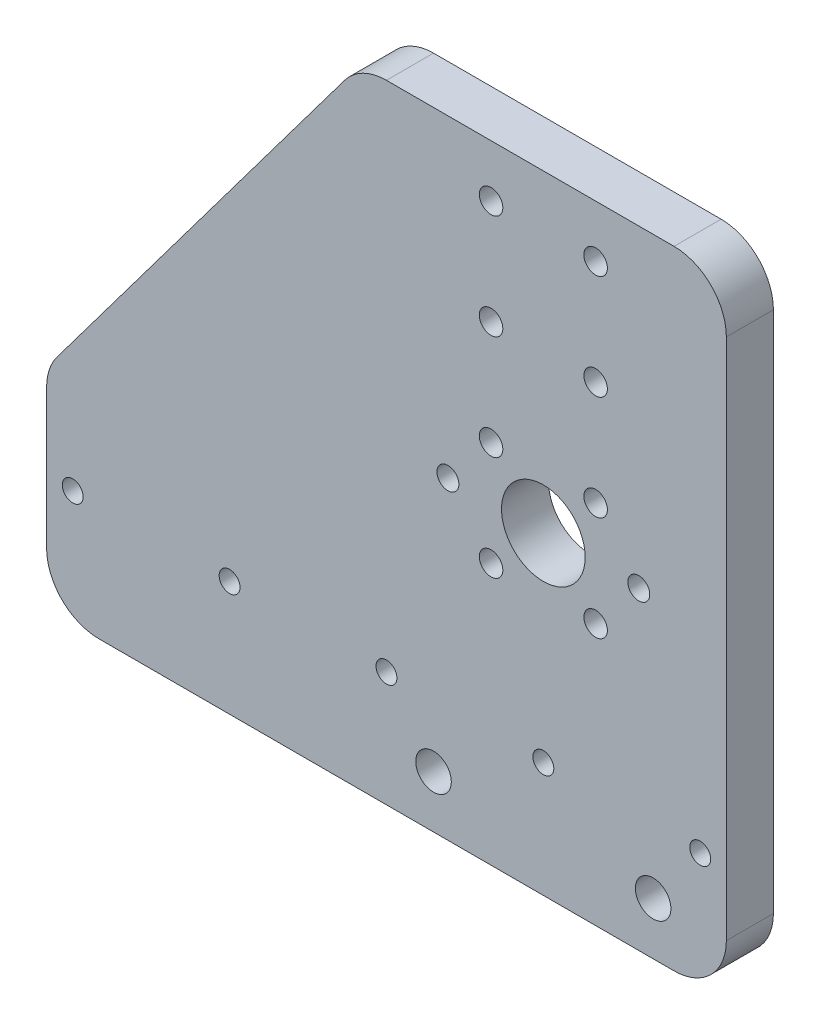
ISO-10303-21;
HEADER;
FILE_DESCRIPTION(('STEP AP214'),'2;1');
FILE_NAME('part.step','',(''),(''),'','','');
FILE_SCHEMA(('AUTOMOTIVE_DESIGN { 1 0 10303 214 1 1 1 1 }'));
ENDSEC;
DATA;
#1=APPLICATION_CONTEXT('core data for automotive mechanical design processes');
#2=APPLICATION_PROTOCOL_DEFINITION('international standard','automotive_design',2000,#1);
#3=PRODUCT_CONTEXT('',#1,'mechanical');
#4=PRODUCT('Part','Part','',(#3));
#5=PRODUCT_RELATED_PRODUCT_CATEGORY('part','',(#4));
#6=PRODUCT_DEFINITION_FORMATION('','',#4);
#7=PRODUCT_DEFINITION_CONTEXT('part definition',#1,'design');
#8=PRODUCT_DEFINITION('design','',#6,#7);
#9=PRODUCT_DEFINITION_SHAPE('','',#8);
#10=(LENGTH_UNIT() NAMED_UNIT(*) SI_UNIT(.MILLI.,.METRE.));
#11=(NAMED_UNIT(*) PLANE_ANGLE_UNIT() SI_UNIT($,.RADIAN.));
#12=(NAMED_UNIT(*) SI_UNIT($,.STERADIAN.) SOLID_ANGLE_UNIT());
#13=UNCERTAINTY_MEASURE_WITH_UNIT(LENGTH_MEASURE(1.E-05),#10,'distance_accuracy_value','');
#14=(GEOMETRIC_REPRESENTATION_CONTEXT(3) GLOBAL_UNCERTAINTY_ASSIGNED_CONTEXT((#13)) GLOBAL_UNIT_ASSIGNED_CONTEXT((#10,
#11,#12)) REPRESENTATION_CONTEXT('',''));
#15=CARTESIAN_POINT('',(0.,0.,0.));
#16=DIRECTION('',(0.,0.,1.));
#17=DIRECTION('',(1.,0.,0.));
#18=AXIS2_PLACEMENT_3D('',#15,#16,#17);
#19=CARTESIAN_POINT('',(0.,40.,9.));
#20=DIRECTION('',(1.,0.,0.));
#21=DIRECTION('',(0.,1.,0.));
#22=AXIS2_PLACEMENT_3D('',#19,#20,#21);
#23=PLANE('',#22);
#24=DIRECTION('',(0.,-1.,0.));
#25=VECTOR('',#24,1.);
#26=CARTESIAN_POINT('',(0.,40.,9.));
#27=LINE('',#26,#25);
#28=CARTESIAN_POINT('',(0.,36.6666666666666,9.));
#29=VERTEX_POINT('',#28);
#30=CARTESIAN_POINT('',(0.,10.,9.));
#31=VERTEX_POINT('',#30);
#32=EDGE_CURVE('E129',#29,#31,#27,.T.);
#33=ORIENTED_EDGE('',*,*,#32,.F.);
#34=DIRECTION('',(0.,0.,-1.));
#35=VECTOR('',#34,1.);
#36=CARTESIAN_POINT('',(0.,36.6666666666666,9.));
#37=LINE('',#36,#35);
#38=CARTESIAN_POINT('',(0.,36.6666666666666,0.));
#39=VERTEX_POINT('',#38);
#40=EDGE_CURVE('E114',#29,#39,#37,.T.);
#41=ORIENTED_EDGE('',*,*,#40,.T.);
#42=DIRECTION('',(0.,-1.,0.));
#43=VECTOR('',#42,1.);
#44=CARTESIAN_POINT('',(0.,40.,0.));
#45=LINE('',#44,#43);
#46=CARTESIAN_POINT('',(0.,10.,0.));
#47=VERTEX_POINT('',#46);
#48=EDGE_CURVE('E126',#39,#47,#45,.T.);
#49=ORIENTED_EDGE('',*,*,#48,.T.);
#50=DIRECTION('',(0.,0.,-1.));
#51=VECTOR('',#50,1.);
#52=CARTESIAN_POINT('',(0.,10.,9.));
#53=LINE('',#52,#51);
#54=EDGE_CURVE('E131',#47,#31,#53,.F.);
#55=ORIENTED_EDGE('',*,*,#54,.T.);
#56=EDGE_LOOP('',(#33,#41,#49,#55));
#57=FACE_BOUND('',#56,.T.);
#58=ADVANCED_FACE('F32',(#57),#23,.F.);
#59=CARTESIAN_POINT('',(0.,0.,9.));
#60=DIRECTION('',(0.,1.,0.));
#61=DIRECTION('',(0.,0.,1.));
#62=AXIS2_PLACEMENT_3D('',#59,#60,#61);
#63=PLANE('',#62);
#64=DIRECTION('',(1.,0.,0.));
#65=VECTOR('',#64,1.);
#66=CARTESIAN_POINT('',(0.,0.,0.));
#67=LINE('',#66,#65);
#68=CARTESIAN_POINT('',(10.,0.,0.));
#69=VERTEX_POINT('',#68);
#70=CARTESIAN_POINT('',(120.,0.,0.));
#71=VERTEX_POINT('',#70);
#72=EDGE_CURVE('E135',#69,#71,#67,.T.);
#73=ORIENTED_EDGE('',*,*,#72,.T.);
#74=DIRECTION('',(0.,0.,-1.));
#75=VECTOR('',#74,1.);
#76=CARTESIAN_POINT('',(120.,0.,9.));
#77=LINE('',#76,#75);
#78=CARTESIAN_POINT('',(120.,0.,9.));
#79=VERTEX_POINT('',#78);
#80=EDGE_CURVE('E11',#71,#79,#77,.F.);
#81=ORIENTED_EDGE('',*,*,#80,.T.);
#82=DIRECTION('',(1.,0.,0.));
#83=VECTOR('',#82,1.);
#84=CARTESIAN_POINT('',(0.,0.,9.));
#85=LINE('',#84,#83);
#86=CARTESIAN_POINT('',(10.,0.,9.));
#87=VERTEX_POINT('',#86);
#88=EDGE_CURVE('E188',#87,#79,#85,.T.);
#89=ORIENTED_EDGE('',*,*,#88,.F.);
#90=DIRECTION('',(0.,0.,-1.));
#91=VECTOR('',#90,1.);
#92=CARTESIAN_POINT('',(10.,0.,9.));
#93=LINE('',#92,#91);
#94=EDGE_CURVE('E40',#87,#69,#93,.T.);
#95=ORIENTED_EDGE('',*,*,#94,.T.);
#96=EDGE_LOOP('',(#73,#81,#89,#95));
#97=FACE_BOUND('',#96,.T.);
#98=ADVANCED_FACE('F185',(#97),#63,.F.);
#99=CARTESIAN_POINT('',(130.,0.,9.));
#100=DIRECTION('',(-1.,0.,0.));
#101=DIRECTION('',(0.,0.,1.));
#102=AXIS2_PLACEMENT_3D('',#99,#100,#101);
#103=PLANE('',#102);
#104=DIRECTION('',(0.,1.,0.));
#105=VECTOR('',#104,1.);
#106=CARTESIAN_POINT('',(130.,0.,0.));
#107=LINE('',#106,#105);
#108=CARTESIAN_POINT('',(130.,10.,0.));
#109=VERTEX_POINT('',#108);
#110=CARTESIAN_POINT('',(130.,110.,0.));
#111=VERTEX_POINT('',#110);
#112=EDGE_CURVE('E139',#109,#111,#107,.T.);
#113=ORIENTED_EDGE('',*,*,#112,.T.);
#114=DIRECTION('',(0.,0.,-1.));
#115=VECTOR('',#114,1.);
#116=CARTESIAN_POINT('',(130.,110.,9.));
#117=LINE('',#116,#115);
#118=CARTESIAN_POINT('',(130.,110.,9.));
#119=VERTEX_POINT('',#118);
#120=EDGE_CURVE('E180',#111,#119,#117,.F.);
#121=ORIENTED_EDGE('',*,*,#120,.T.);
#122=DIRECTION('',(0.,1.,0.));
#123=VECTOR('',#122,1.);
#124=CARTESIAN_POINT('',(130.,0.,9.));
#125=LINE('',#124,#123);
#126=CARTESIAN_POINT('',(130.,10.,9.));
#127=VERTEX_POINT('',#126);
#128=EDGE_CURVE('E200',#127,#119,#125,.T.);
#129=ORIENTED_EDGE('',*,*,#128,.F.);
#130=DIRECTION('',(0.,0.,-1.));
#131=VECTOR('',#130,1.);
#132=CARTESIAN_POINT('',(130.,10.,9.));
#133=LINE('',#132,#131);
#134=EDGE_CURVE('E177',#127,#109,#133,.T.);
#135=ORIENTED_EDGE('',*,*,#134,.T.);
#136=EDGE_LOOP('',(#113,#121,#129,#135));
#137=FACE_BOUND('',#136,.T.);
#138=ADVANCED_FACE('F198',(#137),#103,.F.);
#139=CARTESIAN_POINT('',(130.,120.,9.));
#140=DIRECTION('',(0.,-1.,0.));
#141=DIRECTION('',(1.,0.,0.));
#142=AXIS2_PLACEMENT_3D('',#139,#140,#141);
#143=PLANE('',#142);
#144=DIRECTION('',(-1.,0.,0.));
#145=VECTOR('',#144,1.);
#146=CARTESIAN_POINT('',(130.,120.,0.));
#147=LINE('',#146,#145);
#148=CARTESIAN_POINT('',(120.,120.,0.));
#149=VERTEX_POINT('',#148);
#150=CARTESIAN_POINT('',(65.,120.,0.));
#151=VERTEX_POINT('',#150);
#152=EDGE_CURVE('E150',#149,#151,#147,.T.);
#153=ORIENTED_EDGE('',*,*,#152,.T.);
#154=DIRECTION('',(0.,0.,-1.));
#155=VECTOR('',#154,1.);
#156=CARTESIAN_POINT('',(65.,120.,9.));
#157=LINE('',#156,#155);
#158=CARTESIAN_POINT('',(65.,120.,9.));
#159=VERTEX_POINT('',#158);
#160=EDGE_CURVE('E47',#151,#159,#157,.F.);
#161=ORIENTED_EDGE('',*,*,#160,.T.);
#162=DIRECTION('',(-1.,0.,0.));
#163=VECTOR('',#162,1.);
#164=CARTESIAN_POINT('',(130.,120.,9.));
#165=LINE('',#164,#163);
#166=CARTESIAN_POINT('',(120.,120.,9.));
#167=VERTEX_POINT('',#166);
#168=EDGE_CURVE('E201',#167,#159,#165,.T.);
#169=ORIENTED_EDGE('',*,*,#168,.F.);
#170=DIRECTION('',(0.,0.,-1.));
#171=VECTOR('',#170,1.);
#172=CARTESIAN_POINT('',(120.,120.,9.));
#173=LINE('',#172,#171);
#174=EDGE_CURVE('E173',#167,#149,#173,.T.);
#175=ORIENTED_EDGE('',*,*,#174,.T.);
#176=EDGE_LOOP('',(#153,#161,#169,#175));
#177=FACE_BOUND('',#176,.T.);
#178=ADVANCED_FACE('F376',(#177),#143,.F.);
#179=CARTESIAN_POINT('',(60.,120.,9.));
#180=DIRECTION('',(0.8,-0.6,0.));
#181=DIRECTION('',(0.6,0.8,0.));
#182=AXIS2_PLACEMENT_3D('',#179,#180,#181);
#183=PLANE('',#182);
#184=DIRECTION('',(-0.6,-0.8,0.));
#185=VECTOR('',#184,1.);
#186=CARTESIAN_POINT('',(60.,120.,0.));
#187=LINE('',#186,#185);
#188=CARTESIAN_POINT('',(57.,116.,0.));
#189=VERTEX_POINT('',#188);
#190=CARTESIAN_POINT('',(2.00000000000001,42.6666666666667,0.));
#191=VERTEX_POINT('',#190);
#192=EDGE_CURVE('E152',#189,#191,#187,.T.);
#193=ORIENTED_EDGE('',*,*,#192,.T.);
#194=DIRECTION('',(0.,0.,-1.));
#195=VECTOR('',#194,1.);
#196=CARTESIAN_POINT('',(2.,42.6666666666667,9.));
#197=LINE('',#196,#195);
#198=CARTESIAN_POINT('',(2.00000000000001,42.6666666666667,9.));
#199=VERTEX_POINT('',#198);
#200=EDGE_CURVE('E115',#191,#199,#197,.F.);
#201=ORIENTED_EDGE('',*,*,#200,.T.);
#202=DIRECTION('',(-0.6,-0.8,0.));
#203=VECTOR('',#202,1.);
#204=CARTESIAN_POINT('',(60.,120.,9.));
#205=LINE('',#204,#203);
#206=CARTESIAN_POINT('',(57.,116.,9.));
#207=VERTEX_POINT('',#206);
#208=EDGE_CURVE('E145',#207,#199,#205,.T.);
#209=ORIENTED_EDGE('',*,*,#208,.F.);
#210=DIRECTION('',(0.,0.,-1.));
#211=VECTOR('',#210,1.);
#212=CARTESIAN_POINT('',(57.,116.,9.));
#213=LINE('',#212,#211);
#214=EDGE_CURVE('E120',#207,#189,#213,.T.);
#215=ORIENTED_EDGE('',*,*,#214,.T.);
#216=EDGE_LOOP('',(#193,#201,#209,#215));
#217=FACE_BOUND('',#216,.T.);
#218=ADVANCED_FACE('F366',(#217),#183,.F.);
#219=CARTESIAN_POINT('',(0.,0.,9.));
#220=DIRECTION('',(0.,0.,1.));
#221=DIRECTION('',(1.,0.,0.));
#222=AXIS2_PLACEMENT_3D('',#219,#220,#221);
#223=PLANE('',#222);
#224=CARTESIAN_POINT('',(76.75,60.,9.));
#225=DIRECTION('',(0.,0.,-1.));
#226=DIRECTION('',(1.,0.,0.));
#227=AXIS2_PLACEMENT_3D('',#224,#225,#226);
#228=CIRCLE('',#227,2.1);
#229=CARTESIAN_POINT('',(78.85,60.,9.));
#230=VERTEX_POINT('',#229);
#231=EDGE_CURVE('E302',#230,#230,#228,.T.);
#232=ORIENTED_EDGE('',*,*,#231,.T.);
#233=EDGE_LOOP('',(#232));
#234=FACE_BOUND('',#233,.T.);
#235=CARTESIAN_POINT('',(113.25,60.,9.));
#236=DIRECTION('',(0.,0.,-1.));
#237=DIRECTION('',(-1.,0.,0.));
#238=AXIS2_PLACEMENT_3D('',#235,#236,#237);
#239=CIRCLE('',#238,2.1);
#240=CARTESIAN_POINT('',(111.15,60.,9.));
#241=VERTEX_POINT('',#240);
#242=EDGE_CURVE('E291',#241,#241,#239,.T.);
#243=ORIENTED_EDGE('',*,*,#242,.T.);
#244=EDGE_LOOP('',(#243));
#245=FACE_BOUND('',#244,.T.);
#246=CARTESIAN_POINT('',(74.,9.99999999999999,9.));
#247=DIRECTION('',(0.,0.,1.));
#248=DIRECTION('',(1.,0.,0.));
#249=AXIS2_PLACEMENT_3D('',#246,#247,#248);
#250=CIRCLE('',#249,3.4);
#251=CARTESIAN_POINT('',(77.4,9.99999999999999,9.));
#252=VERTEX_POINT('',#251);
#253=EDGE_CURVE('E294',#252,#252,#250,.T.);
#254=ORIENTED_EDGE('',*,*,#253,.F.);
#255=EDGE_LOOP('',(#254));
#256=FACE_BOUND('',#255,.T.);
#257=CARTESIAN_POINT('',(116.,9.99999999999999,9.));
#258=DIRECTION('',(0.,0.,1.));
#259=DIRECTION('',(-1.,0.,0.));
#260=AXIS2_PLACEMENT_3D('',#257,#258,#259);
#261=CIRCLE('',#260,3.4);
#262=CARTESIAN_POINT('',(112.6,9.99999999999999,9.));
#263=VERTEX_POINT('',#262);
#264=EDGE_CURVE('E287',#263,#263,#261,.T.);
#265=ORIENTED_EDGE('',*,*,#264,.F.);
#266=EDGE_LOOP('',(#265));
#267=FACE_BOUND('',#266,.T.);
#268=CARTESIAN_POINT('',(95.,60.,9.));
#269=DIRECTION('',(0.,0.,1.));
#270=DIRECTION('',(1.,0.,0.));
#271=AXIS2_PLACEMENT_3D('',#268,#269,#270);
#272=CIRCLE('',#271,8.);
#273=CARTESIAN_POINT('',(103.,60.,9.));
#274=VERTEX_POINT('',#273);
#275=EDGE_CURVE('E281',#274,#274,#272,.T.);
#276=ORIENTED_EDGE('',*,*,#275,.F.);
#277=EDGE_LOOP('',(#276));
#278=FACE_BOUND('',#277,.T.);
#279=CARTESIAN_POINT('',(105.,50.,9.));
#280=DIRECTION('',(0.,0.,1.));
#281=DIRECTION('',(1.,0.,0.));
#282=AXIS2_PLACEMENT_3D('',#279,#280,#281);
#283=CIRCLE('',#282,2.25000000000001);
#284=CARTESIAN_POINT('',(107.25,50.,9.));
#285=VERTEX_POINT('',#284);
#286=EDGE_CURVE('E251',#285,#285,#283,.T.);
#287=ORIENTED_EDGE('',*,*,#286,.F.);
#288=EDGE_LOOP('',(#287));
#289=FACE_BOUND('',#288,.T.);
#290=CARTESIAN_POINT('',(105.,110.,9.));
#291=DIRECTION('',(0.,0.,1.));
#292=DIRECTION('',(-1.,0.,0.));
#293=AXIS2_PLACEMENT_3D('',#290,#291,#292);
#294=CIRCLE('',#293,2.25000000000001);
#295=CARTESIAN_POINT('',(102.75,110.,9.));
#296=VERTEX_POINT('',#295);
#297=EDGE_CURVE('E258',#296,#296,#294,.T.);
#298=ORIENTED_EDGE('',*,*,#297,.F.);
#299=EDGE_LOOP('',(#298));
#300=FACE_BOUND('',#299,.T.);
#301=CARTESIAN_POINT('',(105.,90.,9.));
#302=DIRECTION('',(0.,0.,1.));
#303=DIRECTION('',(1.,0.,0.));
#304=AXIS2_PLACEMENT_3D('',#301,#302,#303);
#305=CIRCLE('',#304,2.25000000000001);
#306=CARTESIAN_POINT('',(107.25,90.,9.));
#307=VERTEX_POINT('',#306);
#308=EDGE_CURVE('E245',#307,#307,#305,.T.);
#309=ORIENTED_EDGE('',*,*,#308,.F.);
#310=EDGE_LOOP('',(#309));
#311=FACE_BOUND('',#310,.T.);
#312=CARTESIAN_POINT('',(105.,70.,9.));
#313=DIRECTION('',(0.,0.,1.));
#314=DIRECTION('',(-1.,0.,0.));
#315=AXIS2_PLACEMENT_3D('',#312,#313,#314);
#316=CIRCLE('',#315,2.25000000000001);
#317=CARTESIAN_POINT('',(102.75,70.,9.));
#318=VERTEX_POINT('',#317);
#319=EDGE_CURVE('E276',#318,#318,#316,.T.);
#320=ORIENTED_EDGE('',*,*,#319,.F.);
#321=EDGE_LOOP('',(#320));
#322=FACE_BOUND('',#321,.T.);
#323=CARTESIAN_POINT('',(85.,70.,9.));
#324=DIRECTION('',(0.,0.,1.));
#325=DIRECTION('',(1.,0.,0.));
#326=AXIS2_PLACEMENT_3D('',#323,#324,#325);
#327=CIRCLE('',#326,2.25);
#328=CARTESIAN_POINT('',(87.25,70.,9.));
#329=VERTEX_POINT('',#328);
#330=EDGE_CURVE('E270',#329,#329,#327,.T.);
#331=ORIENTED_EDGE('',*,*,#330,.F.);
#332=EDGE_LOOP('',(#331));
#333=FACE_BOUND('',#332,.T.);
#334=CARTESIAN_POINT('',(85.,50.,9.));
#335=DIRECTION('',(0.,0.,1.));
#336=DIRECTION('',(-1.,0.,0.));
#337=AXIS2_PLACEMENT_3D('',#334,#335,#336);
#338=CIRCLE('',#337,2.25);
#339=CARTESIAN_POINT('',(82.75,50.,9.));
#340=VERTEX_POINT('',#339);
#341=EDGE_CURVE('E263',#340,#340,#338,.T.);
#342=ORIENTED_EDGE('',*,*,#341,.F.);
#343=EDGE_LOOP('',(#342));
#344=FACE_BOUND('',#343,.T.);
#345=CARTESIAN_POINT('',(125.,22.,9.));
#346=DIRECTION('',(0.,0.,1.));
#347=DIRECTION('',(-1.,0.,0.));
#348=AXIS2_PLACEMENT_3D('',#345,#346,#347);
#349=CIRCLE('',#348,2.);
#350=CARTESIAN_POINT('',(123.,22.,9.));
#351=VERTEX_POINT('',#350);
#352=EDGE_CURVE('E215',#351,#351,#349,.T.);
#353=ORIENTED_EDGE('',*,*,#352,.F.);
#354=EDGE_LOOP('',(#353));
#355=FACE_BOUND('',#354,.T.);
#356=CARTESIAN_POINT('',(5.,22.,9.));
#357=DIRECTION('',(0.,0.,1.));
#358=DIRECTION('',(1.,0.,0.));
#359=AXIS2_PLACEMENT_3D('',#356,#357,#358);
#360=CIRCLE('',#359,2.);
#361=CARTESIAN_POINT('',(7.00000000000001,22.,9.));
#362=VERTEX_POINT('',#361);
#363=EDGE_CURVE('E222',#362,#362,#360,.T.);
#364=ORIENTED_EDGE('',*,*,#363,.F.);
#365=EDGE_LOOP('',(#364));
#366=FACE_BOUND('',#365,.T.);
#367=CARTESIAN_POINT('',(35.,22.,9.));
#368=DIRECTION('',(0.,0.,1.));
#369=DIRECTION('',(1.,0.,0.));
#370=AXIS2_PLACEMENT_3D('',#367,#368,#369);
#371=CIRCLE('',#370,2.);
#372=CARTESIAN_POINT('',(37.,22.,9.));
#373=VERTEX_POINT('',#372);
#374=EDGE_CURVE('E209',#373,#373,#371,.T.);
#375=ORIENTED_EDGE('',*,*,#374,.F.);
#376=EDGE_LOOP('',(#375));
#377=FACE_BOUND('',#376,.T.);
#378=CARTESIAN_POINT('',(95.,22.,9.));
#379=DIRECTION('',(0.,0.,1.));
#380=DIRECTION('',(-1.,0.,0.));
#381=AXIS2_PLACEMENT_3D('',#378,#379,#380);
#382=CIRCLE('',#381,2.);
#383=CARTESIAN_POINT('',(93.,22.,9.));
#384=VERTEX_POINT('',#383);
#385=EDGE_CURVE('E240',#384,#384,#382,.T.);
#386=ORIENTED_EDGE('',*,*,#385,.F.);
#387=EDGE_LOOP('',(#386));
#388=FACE_BOUND('',#387,.T.);
#389=CARTESIAN_POINT('',(85.,110.,9.));
#390=DIRECTION('',(0.,0.,1.));
#391=DIRECTION('',(1.,0.,0.));
#392=AXIS2_PLACEMENT_3D('',#389,#390,#391);
#393=CIRCLE('',#392,2.25);
#394=CARTESIAN_POINT('',(87.25,110.,9.));
#395=VERTEX_POINT('',#394);
#396=EDGE_CURVE('E234',#395,#395,#393,.T.);
#397=ORIENTED_EDGE('',*,*,#396,.F.);
#398=EDGE_LOOP('',(#397));
#399=FACE_BOUND('',#398,.T.);
#400=CARTESIAN_POINT('',(85.,90.,9.));
#401=DIRECTION('',(0.,0.,1.));
#402=DIRECTION('',(-1.,0.,0.));
#403=AXIS2_PLACEMENT_3D('',#400,#401,#402);
#404=CIRCLE('',#403,2.25);
#405=CARTESIAN_POINT('',(82.75,90.,9.));
#406=VERTEX_POINT('',#405);
#407=EDGE_CURVE('E227',#406,#406,#404,.T.);
#408=ORIENTED_EDGE('',*,*,#407,.F.);
#409=EDGE_LOOP('',(#408));
#410=FACE_BOUND('',#409,.T.);
#411=CARTESIAN_POINT('',(65.,22.,9.));
#412=DIRECTION('',(0.,0.,1.));
#413=DIRECTION('',(1.,0.,0.));
#414=AXIS2_PLACEMENT_3D('',#411,#412,#413);
#415=CIRCLE('',#414,2.);
#416=CARTESIAN_POINT('',(67.,22.,9.));
#417=VERTEX_POINT('',#416);
#418=EDGE_CURVE('E142',#417,#417,#415,.T.);
#419=ORIENTED_EDGE('',*,*,#418,.F.);
#420=EDGE_LOOP('',(#419));
#421=FACE_BOUND('',#420,.T.);
#422=ORIENTED_EDGE('',*,*,#208,.T.);
#423=CARTESIAN_POINT('',(10.,36.6666666666666,9.));
#424=DIRECTION('',(0.,0.,1.));
#425=DIRECTION('',(1.,0.,0.));
#426=AXIS2_PLACEMENT_3D('',#423,#424,#425);
#427=CIRCLE('',#426,10.);
#428=EDGE_CURVE('E171',#199,#29,#427,.T.);
#429=ORIENTED_EDGE('',*,*,#428,.T.);
#430=ORIENTED_EDGE('',*,*,#32,.T.);
#431=CARTESIAN_POINT('',(10.,10.,9.));
#432=DIRECTION('',(0.,0.,1.));
#433=DIRECTION('',(1.,0.,0.));
#434=AXIS2_PLACEMENT_3D('',#431,#432,#433);
#435=CIRCLE('',#434,10.);
#436=EDGE_CURVE('E164',#31,#87,#435,.T.);
#437=ORIENTED_EDGE('',*,*,#436,.T.);
#438=ORIENTED_EDGE('',*,*,#88,.T.);
#439=CARTESIAN_POINT('',(120.,10.,9.));
#440=DIRECTION('',(0.,0.,1.));
#441=DIRECTION('',(1.,0.,0.));
#442=AXIS2_PLACEMENT_3D('',#439,#440,#441);
#443=CIRCLE('',#442,10.);
#444=EDGE_CURVE('E166',#79,#127,#443,.T.);
#445=ORIENTED_EDGE('',*,*,#444,.T.);
#446=ORIENTED_EDGE('',*,*,#128,.T.);
#447=CARTESIAN_POINT('',(120.,110.,9.));
#448=DIRECTION('',(0.,0.,1.));
#449=DIRECTION('',(1.,0.,0.));
#450=AXIS2_PLACEMENT_3D('',#447,#448,#449);
#451=CIRCLE('',#450,10.);
#452=EDGE_CURVE('E54',#119,#167,#451,.T.);
#453=ORIENTED_EDGE('',*,*,#452,.T.);
#454=ORIENTED_EDGE('',*,*,#168,.T.);
#455=CARTESIAN_POINT('',(65.,110.,9.));
#456=DIRECTION('',(0.,0.,1.));
#457=DIRECTION('',(1.,0.,0.));
#458=AXIS2_PLACEMENT_3D('',#455,#456,#457);
#459=CIRCLE('',#458,10.);
#460=EDGE_CURVE('E169',#159,#207,#459,.T.);
#461=ORIENTED_EDGE('',*,*,#460,.T.);
#462=EDGE_LOOP('',(#422,#429,#430,#437,#438,#445,#446,#453,#454,#461));
#463=FACE_BOUND('',#462,.T.);
#464=ADVANCED_FACE('F311',(#234,#245,#256,#267,#278,#289,#300,#311,#322,#333,#344,#355,#366,
#377,#388,#399,#410,#421,#463),#223,.T.);
#465=CARTESIAN_POINT('',(0.,0.,0.));
#466=DIRECTION('',(0.,0.,1.));
#467=DIRECTION('',(1.,0.,0.));
#468=AXIS2_PLACEMENT_3D('',#465,#466,#467);
#469=PLANE('',#468);
#470=CARTESIAN_POINT('',(76.75,60.,0.));
#471=DIRECTION('',(0.,0.,-1.));
#472=DIRECTION('',(1.,0.,0.));
#473=AXIS2_PLACEMENT_3D('',#470,#471,#472);
#474=CIRCLE('',#473,2.1);
#475=CARTESIAN_POINT('',(78.85,60.,0.));
#476=VERTEX_POINT('',#475);
#477=EDGE_CURVE('E305',#476,#476,#474,.T.);
#478=ORIENTED_EDGE('',*,*,#477,.F.);
#479=EDGE_LOOP('',(#478));
#480=FACE_BOUND('',#479,.T.);
#481=CARTESIAN_POINT('',(113.25,60.,0.));
#482=DIRECTION('',(0.,0.,-1.));
#483=DIRECTION('',(-1.,0.,0.));
#484=AXIS2_PLACEMENT_3D('',#481,#482,#483);
#485=CIRCLE('',#484,2.1);
#486=CARTESIAN_POINT('',(111.15,60.,0.));
#487=VERTEX_POINT('',#486);
#488=EDGE_CURVE('E299',#487,#487,#485,.T.);
#489=ORIENTED_EDGE('',*,*,#488,.F.);
#490=EDGE_LOOP('',(#489));
#491=FACE_BOUND('',#490,.T.);
#492=CARTESIAN_POINT('',(74.,9.99999999999999,0.));
#493=DIRECTION('',(0.,0.,1.));
#494=DIRECTION('',(1.,0.,0.));
#495=AXIS2_PLACEMENT_3D('',#492,#493,#494);
#496=CIRCLE('',#495,3.4);
#497=CARTESIAN_POINT('',(77.4,9.99999999999999,0.));
#498=VERTEX_POINT('',#497);
#499=EDGE_CURVE('E284',#498,#498,#496,.T.);
#500=ORIENTED_EDGE('',*,*,#499,.T.);
#501=EDGE_LOOP('',(#500));
#502=FACE_BOUND('',#501,.T.);
#503=CARTESIAN_POINT('',(116.,9.99999999999999,0.));
#504=DIRECTION('',(0.,0.,1.));
#505=DIRECTION('',(-1.,0.,0.));
#506=AXIS2_PLACEMENT_3D('',#503,#504,#505);
#507=CIRCLE('',#506,3.4);
#508=CARTESIAN_POINT('',(112.6,9.99999999999999,0.));
#509=VERTEX_POINT('',#508);
#510=EDGE_CURVE('E290',#509,#509,#507,.T.);
#511=ORIENTED_EDGE('',*,*,#510,.T.);
#512=EDGE_LOOP('',(#511));
#513=FACE_BOUND('',#512,.T.);
#514=CARTESIAN_POINT('',(95.,60.,0.));
#515=DIRECTION('',(0.,0.,1.));
#516=DIRECTION('',(1.,0.,0.));
#517=AXIS2_PLACEMENT_3D('',#514,#515,#516);
#518=CIRCLE('',#517,8.);
#519=CARTESIAN_POINT('',(103.,60.,0.));
#520=VERTEX_POINT('',#519);
#521=EDGE_CURVE('E267',#520,#520,#518,.T.);
#522=ORIENTED_EDGE('',*,*,#521,.T.);
#523=EDGE_LOOP('',(#522));
#524=FACE_BOUND('',#523,.T.);
#525=CARTESIAN_POINT('',(105.,50.,0.));
#526=DIRECTION('',(0.,0.,1.));
#527=DIRECTION('',(1.,0.,0.));
#528=AXIS2_PLACEMENT_3D('',#525,#526,#527);
#529=CIRCLE('',#528,2.25000000000001);
#530=CARTESIAN_POINT('',(107.25,50.,0.));
#531=VERTEX_POINT('',#530);
#532=EDGE_CURVE('E254',#531,#531,#529,.T.);
#533=ORIENTED_EDGE('',*,*,#532,.T.);
#534=EDGE_LOOP('',(#533));
#535=FACE_BOUND('',#534,.T.);
#536=CARTESIAN_POINT('',(105.,110.,0.));
#537=DIRECTION('',(0.,0.,1.));
#538=DIRECTION('',(-1.,0.,0.));
#539=AXIS2_PLACEMENT_3D('',#536,#537,#538);
#540=CIRCLE('',#539,2.25000000000001);
#541=CARTESIAN_POINT('',(102.75,110.,0.));
#542=VERTEX_POINT('',#541);
#543=EDGE_CURVE('E248',#542,#542,#540,.T.);
#544=ORIENTED_EDGE('',*,*,#543,.T.);
#545=EDGE_LOOP('',(#544));
#546=FACE_BOUND('',#545,.T.);
#547=CARTESIAN_POINT('',(105.,90.,0.));
#548=DIRECTION('',(0.,0.,1.));
#549=DIRECTION('',(1.,0.,0.));
#550=AXIS2_PLACEMENT_3D('',#547,#548,#549);
#551=CIRCLE('',#550,2.25000000000001);
#552=CARTESIAN_POINT('',(107.25,90.,0.));
#553=VERTEX_POINT('',#552);
#554=EDGE_CURVE('E231',#553,#553,#551,.T.);
#555=ORIENTED_EDGE('',*,*,#554,.T.);
#556=EDGE_LOOP('',(#555));
#557=FACE_BOUND('',#556,.T.);
#558=CARTESIAN_POINT('',(105.,70.,0.));
#559=DIRECTION('',(0.,0.,1.));
#560=DIRECTION('',(-1.,0.,0.));
#561=AXIS2_PLACEMENT_3D('',#558,#559,#560);
#562=CIRCLE('',#561,2.25000000000001);
#563=CARTESIAN_POINT('',(102.75,70.,0.));
#564=VERTEX_POINT('',#563);
#565=EDGE_CURVE('E255',#564,#564,#562,.T.);
#566=ORIENTED_EDGE('',*,*,#565,.T.);
#567=EDGE_LOOP('',(#566));
#568=FACE_BOUND('',#567,.T.);
#569=CARTESIAN_POINT('',(85.,70.,0.));
#570=DIRECTION('',(0.,0.,1.));
#571=DIRECTION('',(1.,0.,0.));
#572=AXIS2_PLACEMENT_3D('',#569,#570,#571);
#573=CIRCLE('',#572,2.25);
#574=CARTESIAN_POINT('',(87.25,70.,0.));
#575=VERTEX_POINT('',#574);
#576=EDGE_CURVE('E273',#575,#575,#573,.T.);
#577=ORIENTED_EDGE('',*,*,#576,.T.);
#578=EDGE_LOOP('',(#577));
#579=FACE_BOUND('',#578,.T.);
#580=CARTESIAN_POINT('',(85.,50.,0.));
#581=DIRECTION('',(0.,0.,1.));
#582=DIRECTION('',(-1.,0.,0.));
#583=AXIS2_PLACEMENT_3D('',#580,#581,#582);
#584=CIRCLE('',#583,2.25);
#585=CARTESIAN_POINT('',(82.75,50.,0.));
#586=VERTEX_POINT('',#585);
#587=EDGE_CURVE('E266',#586,#586,#584,.T.);
#588=ORIENTED_EDGE('',*,*,#587,.T.);
#589=EDGE_LOOP('',(#588));
#590=FACE_BOUND('',#589,.T.);
#591=CARTESIAN_POINT('',(125.,22.,0.));
#592=DIRECTION('',(0.,0.,1.));
#593=DIRECTION('',(-1.,0.,0.));
#594=AXIS2_PLACEMENT_3D('',#591,#592,#593);
#595=CIRCLE('',#594,2.);
#596=CARTESIAN_POINT('',(123.,22.,0.));
#597=VERTEX_POINT('',#596);
#598=EDGE_CURVE('E218',#597,#597,#595,.T.);
#599=ORIENTED_EDGE('',*,*,#598,.T.);
#600=EDGE_LOOP('',(#599));
#601=FACE_BOUND('',#600,.T.);
#602=CARTESIAN_POINT('',(5.,22.,0.));
#603=DIRECTION('',(0.,0.,1.));
#604=DIRECTION('',(1.,0.,0.));
#605=AXIS2_PLACEMENT_3D('',#602,#603,#604);
#606=CIRCLE('',#605,2.);
#607=CARTESIAN_POINT('',(7.00000000000001,22.,0.));
#608=VERTEX_POINT('',#607);
#609=EDGE_CURVE('E212',#608,#608,#606,.T.);
#610=ORIENTED_EDGE('',*,*,#609,.T.);
#611=EDGE_LOOP('',(#610));
#612=FACE_BOUND('',#611,.T.);
#613=CARTESIAN_POINT('',(35.,22.,0.));
#614=DIRECTION('',(0.,0.,1.));
#615=DIRECTION('',(1.,0.,0.));
#616=AXIS2_PLACEMENT_3D('',#613,#614,#615);
#617=CIRCLE('',#616,2.);
#618=CARTESIAN_POINT('',(37.,22.,0.));
#619=VERTEX_POINT('',#618);
#620=EDGE_CURVE('E207',#619,#619,#617,.T.);
#621=ORIENTED_EDGE('',*,*,#620,.T.);
#622=EDGE_LOOP('',(#621));
#623=FACE_BOUND('',#622,.T.);
#624=CARTESIAN_POINT('',(95.,22.,0.));
#625=DIRECTION('',(0.,0.,1.));
#626=DIRECTION('',(-1.,0.,0.));
#627=AXIS2_PLACEMENT_3D('',#624,#625,#626);
#628=CIRCLE('',#627,2.);
#629=CARTESIAN_POINT('',(93.,22.,0.));
#630=VERTEX_POINT('',#629);
#631=EDGE_CURVE('E219',#630,#630,#628,.T.);
#632=ORIENTED_EDGE('',*,*,#631,.T.);
#633=EDGE_LOOP('',(#632));
#634=FACE_BOUND('',#633,.T.);
#635=CARTESIAN_POINT('',(85.,110.,0.));
#636=DIRECTION('',(0.,0.,1.));
#637=DIRECTION('',(1.,0.,0.));
#638=AXIS2_PLACEMENT_3D('',#635,#636,#637);
#639=CIRCLE('',#638,2.25);
#640=CARTESIAN_POINT('',(87.25,110.,0.));
#641=VERTEX_POINT('',#640);
#642=EDGE_CURVE('E237',#641,#641,#639,.T.);
#643=ORIENTED_EDGE('',*,*,#642,.T.);
#644=EDGE_LOOP('',(#643));
#645=FACE_BOUND('',#644,.T.);
#646=CARTESIAN_POINT('',(85.,90.,0.));
#647=DIRECTION('',(0.,0.,1.));
#648=DIRECTION('',(-1.,0.,0.));
#649=AXIS2_PLACEMENT_3D('',#646,#647,#648);
#650=CIRCLE('',#649,2.25);
#651=CARTESIAN_POINT('',(82.75,90.,0.));
#652=VERTEX_POINT('',#651);
#653=EDGE_CURVE('E230',#652,#652,#650,.T.);
#654=ORIENTED_EDGE('',*,*,#653,.T.);
#655=EDGE_LOOP('',(#654));
#656=FACE_BOUND('',#655,.T.);
#657=CARTESIAN_POINT('',(65.,22.,0.));
#658=DIRECTION('',(0.,0.,1.));
#659=DIRECTION('',(1.,0.,0.));
#660=AXIS2_PLACEMENT_3D('',#657,#658,#659);
#661=CIRCLE('',#660,2.);
#662=CARTESIAN_POINT('',(67.,22.,0.));
#663=VERTEX_POINT('',#662);
#664=EDGE_CURVE('E136',#663,#663,#661,.T.);
#665=ORIENTED_EDGE('',*,*,#664,.T.);
#666=EDGE_LOOP('',(#665));
#667=FACE_BOUND('',#666,.T.);
#668=ORIENTED_EDGE('',*,*,#48,.F.);
#669=CARTESIAN_POINT('',(10.,36.6666666666666,0.));
#670=DIRECTION('',(0.,0.,1.));
#671=DIRECTION('',(1.,0.,0.));
#672=AXIS2_PLACEMENT_3D('',#669,#670,#671);
#673=CIRCLE('',#672,10.);
#674=EDGE_CURVE('E110',#39,#191,#673,.F.);
#675=ORIENTED_EDGE('',*,*,#674,.T.);
#676=ORIENTED_EDGE('',*,*,#192,.F.);
#677=CARTESIAN_POINT('',(65.,110.,0.));
#678=DIRECTION('',(0.,0.,1.));
#679=DIRECTION('',(1.,0.,0.));
#680=AXIS2_PLACEMENT_3D('',#677,#678,#679);
#681=CIRCLE('',#680,10.);
#682=EDGE_CURVE('E121',#189,#151,#681,.F.);
#683=ORIENTED_EDGE('',*,*,#682,.T.);
#684=ORIENTED_EDGE('',*,*,#152,.F.);
#685=CARTESIAN_POINT('',(120.,110.,0.));
#686=DIRECTION('',(0.,0.,1.));
#687=DIRECTION('',(1.,0.,0.));
#688=AXIS2_PLACEMENT_3D('',#685,#686,#687);
#689=CIRCLE('',#688,10.);
#690=EDGE_CURVE('E158',#149,#111,#689,.F.);
#691=ORIENTED_EDGE('',*,*,#690,.T.);
#692=ORIENTED_EDGE('',*,*,#112,.F.);
#693=CARTESIAN_POINT('',(120.,10.,0.));
#694=DIRECTION('',(0.,0.,1.));
#695=DIRECTION('',(1.,0.,0.));
#696=AXIS2_PLACEMENT_3D('',#693,#694,#695);
#697=CIRCLE('',#696,10.);
#698=EDGE_CURVE('E156',#109,#71,#697,.F.);
#699=ORIENTED_EDGE('',*,*,#698,.T.);
#700=ORIENTED_EDGE('',*,*,#72,.F.);
#701=CARTESIAN_POINT('',(10.,10.,0.));
#702=DIRECTION('',(0.,0.,1.));
#703=DIRECTION('',(1.,0.,0.));
#704=AXIS2_PLACEMENT_3D('',#701,#702,#703);
#705=CIRCLE('',#704,10.);
#706=EDGE_CURVE('E130',#69,#47,#705,.F.);
#707=ORIENTED_EDGE('',*,*,#706,.T.);
#708=EDGE_LOOP('',(#668,#675,#676,#683,#684,#691,#692,#699,#700,#707));
#709=FACE_BOUND('',#708,.T.);
#710=ADVANCED_FACE('F133',(#480,#491,#502,#513,#524,#535,#546,#557,#568,#579,#590,#601,#612,
#623,#634,#645,#656,#667,#709),#469,.F.);
#711=CARTESIAN_POINT('',(65.,22.,0.));
#712=DIRECTION('',(0.,0.,1.));
#713=DIRECTION('',(1.,0.,0.));
#714=AXIS2_PLACEMENT_3D('',#711,#712,#713);
#715=CYLINDRICAL_SURFACE('',#714,2.);
#716=ORIENTED_EDGE('',*,*,#664,.F.);
#717=EDGE_LOOP('',(#716));
#718=FACE_BOUND('',#717,.T.);
#719=ORIENTED_EDGE('',*,*,#418,.T.);
#720=EDGE_LOOP('',(#719));
#721=FACE_BOUND('',#720,.T.);
#722=ADVANCED_FACE('F323',(#718,#721),#715,.F.);
#723=CARTESIAN_POINT('',(85.,90.,0.));
#724=DIRECTION('',(0.,0.,1.));
#725=DIRECTION('',(1.,0.,0.));
#726=AXIS2_PLACEMENT_3D('',#723,#724,#725);
#727=CYLINDRICAL_SURFACE('',#726,2.25);
#728=ORIENTED_EDGE('',*,*,#653,.F.);
#729=EDGE_LOOP('',(#728));
#730=FACE_BOUND('',#729,.T.);
#731=ORIENTED_EDGE('',*,*,#407,.T.);
#732=EDGE_LOOP('',(#731));
#733=FACE_BOUND('',#732,.T.);
#734=ADVANCED_FACE('F361',(#730,#733),#727,.F.);
#735=CARTESIAN_POINT('',(85.,110.,0.));
#736=DIRECTION('',(0.,0.,1.));
#737=DIRECTION('',(1.,0.,0.));
#738=AXIS2_PLACEMENT_3D('',#735,#736,#737);
#739=CYLINDRICAL_SURFACE('',#738,2.25);
#740=ORIENTED_EDGE('',*,*,#642,.F.);
#741=EDGE_LOOP('',(#740));
#742=FACE_BOUND('',#741,.T.);
#743=ORIENTED_EDGE('',*,*,#396,.T.);
#744=EDGE_LOOP('',(#743));
#745=FACE_BOUND('',#744,.T.);
#746=ADVANCED_FACE('F444',(#742,#745),#739,.F.);
#747=CARTESIAN_POINT('',(95.,22.,0.));
#748=DIRECTION('',(0.,0.,1.));
#749=DIRECTION('',(1.,0.,0.));
#750=AXIS2_PLACEMENT_3D('',#747,#748,#749);
#751=CYLINDRICAL_SURFACE('',#750,2.);
#752=ORIENTED_EDGE('',*,*,#631,.F.);
#753=EDGE_LOOP('',(#752));
#754=FACE_BOUND('',#753,.T.);
#755=ORIENTED_EDGE('',*,*,#385,.T.);
#756=EDGE_LOOP('',(#755));
#757=FACE_BOUND('',#756,.T.);
#758=ADVANCED_FACE('F440',(#754,#757),#751,.F.);
#759=CARTESIAN_POINT('',(35.,22.,0.));
#760=DIRECTION('',(0.,0.,1.));
#761=DIRECTION('',(1.,0.,0.));
#762=AXIS2_PLACEMENT_3D('',#759,#760,#761);
#763=CYLINDRICAL_SURFACE('',#762,2.);
#764=ORIENTED_EDGE('',*,*,#620,.F.);
#765=EDGE_LOOP('',(#764));
#766=FACE_BOUND('',#765,.T.);
#767=ORIENTED_EDGE('',*,*,#374,.T.);
#768=EDGE_LOOP('',(#767));
#769=FACE_BOUND('',#768,.T.);
#770=ADVANCED_FACE('F443',(#766,#769),#763,.F.);
#771=CARTESIAN_POINT('',(5.,22.,0.));
#772=DIRECTION('',(0.,0.,1.));
#773=DIRECTION('',(1.,0.,0.));
#774=AXIS2_PLACEMENT_3D('',#771,#772,#773);
#775=CYLINDRICAL_SURFACE('',#774,2.);
#776=ORIENTED_EDGE('',*,*,#609,.F.);
#777=EDGE_LOOP('',(#776));
#778=FACE_BOUND('',#777,.T.);
#779=ORIENTED_EDGE('',*,*,#363,.T.);
#780=EDGE_LOOP('',(#779));
#781=FACE_BOUND('',#780,.T.);
#782=ADVANCED_FACE('F452',(#778,#781),#775,.F.);
#783=CARTESIAN_POINT('',(125.,22.,0.));
#784=DIRECTION('',(0.,0.,1.));
#785=DIRECTION('',(1.,0.,0.));
#786=AXIS2_PLACEMENT_3D('',#783,#784,#785);
#787=CYLINDRICAL_SURFACE('',#786,2.);
#788=ORIENTED_EDGE('',*,*,#598,.F.);
#789=EDGE_LOOP('',(#788));
#790=FACE_BOUND('',#789,.T.);
#791=ORIENTED_EDGE('',*,*,#352,.T.);
#792=EDGE_LOOP('',(#791));
#793=FACE_BOUND('',#792,.T.);
#794=ADVANCED_FACE('F428',(#790,#793),#787,.F.);
#795=CARTESIAN_POINT('',(85.,50.,0.));
#796=DIRECTION('',(0.,0.,1.));
#797=DIRECTION('',(1.,0.,0.));
#798=AXIS2_PLACEMENT_3D('',#795,#796,#797);
#799=CYLINDRICAL_SURFACE('',#798,2.25);
#800=ORIENTED_EDGE('',*,*,#587,.F.);
#801=EDGE_LOOP('',(#800));
#802=FACE_BOUND('',#801,.T.);
#803=ORIENTED_EDGE('',*,*,#341,.T.);
#804=EDGE_LOOP('',(#803));
#805=FACE_BOUND('',#804,.T.);
#806=ADVANCED_FACE('F424',(#802,#805),#799,.F.);
#807=CARTESIAN_POINT('',(85.,70.,0.));
#808=DIRECTION('',(0.,0.,1.));
#809=DIRECTION('',(1.,0.,0.));
#810=AXIS2_PLACEMENT_3D('',#807,#808,#809);
#811=CYLINDRICAL_SURFACE('',#810,2.25);
#812=ORIENTED_EDGE('',*,*,#576,.F.);
#813=EDGE_LOOP('',(#812));
#814=FACE_BOUND('',#813,.T.);
#815=ORIENTED_EDGE('',*,*,#330,.T.);
#816=EDGE_LOOP('',(#815));
#817=FACE_BOUND('',#816,.T.);
#818=ADVANCED_FACE('F420',(#814,#817),#811,.F.);
#819=CARTESIAN_POINT('',(105.,70.,0.));
#820=DIRECTION('',(0.,0.,1.));
#821=DIRECTION('',(1.,0.,0.));
#822=AXIS2_PLACEMENT_3D('',#819,#820,#821);
#823=CYLINDRICAL_SURFACE('',#822,2.25000000000001);
#824=ORIENTED_EDGE('',*,*,#565,.F.);
#825=EDGE_LOOP('',(#824));
#826=FACE_BOUND('',#825,.T.);
#827=ORIENTED_EDGE('',*,*,#319,.T.);
#828=EDGE_LOOP('',(#827));
#829=FACE_BOUND('',#828,.T.);
#830=ADVANCED_FACE('F416',(#826,#829),#823,.F.);
#831=CARTESIAN_POINT('',(105.,90.,0.));
#832=DIRECTION('',(0.,0.,1.));
#833=DIRECTION('',(1.,0.,0.));
#834=AXIS2_PLACEMENT_3D('',#831,#832,#833);
#835=CYLINDRICAL_SURFACE('',#834,2.25000000000001);
#836=ORIENTED_EDGE('',*,*,#554,.F.);
#837=EDGE_LOOP('',(#836));
#838=FACE_BOUND('',#837,.T.);
#839=ORIENTED_EDGE('',*,*,#308,.T.);
#840=EDGE_LOOP('',(#839));
#841=FACE_BOUND('',#840,.T.);
#842=ADVANCED_FACE('F419',(#838,#841),#835,.F.);
#843=CARTESIAN_POINT('',(105.,110.,0.));
#844=DIRECTION('',(0.,0.,1.));
#845=DIRECTION('',(1.,0.,0.));
#846=AXIS2_PLACEMENT_3D('',#843,#844,#845);
#847=CYLINDRICAL_SURFACE('',#846,2.25000000000001);
#848=ORIENTED_EDGE('',*,*,#543,.F.);
#849=EDGE_LOOP('',(#848));
#850=FACE_BOUND('',#849,.T.);
#851=ORIENTED_EDGE('',*,*,#297,.T.);
#852=EDGE_LOOP('',(#851));
#853=FACE_BOUND('',#852,.T.);
#854=ADVANCED_FACE('F430',(#850,#853),#847,.F.);
#855=CARTESIAN_POINT('',(105.,50.,0.));
#856=DIRECTION('',(0.,0.,1.));
#857=DIRECTION('',(1.,0.,0.));
#858=AXIS2_PLACEMENT_3D('',#855,#856,#857);
#859=CYLINDRICAL_SURFACE('',#858,2.25000000000001);
#860=ORIENTED_EDGE('',*,*,#532,.F.);
#861=EDGE_LOOP('',(#860));
#862=FACE_BOUND('',#861,.T.);
#863=ORIENTED_EDGE('',*,*,#286,.T.);
#864=EDGE_LOOP('',(#863));
#865=FACE_BOUND('',#864,.T.);
#866=ADVANCED_FACE('F414',(#862,#865),#859,.F.);
#867=CARTESIAN_POINT('',(95.,60.,0.));
#868=DIRECTION('',(0.,0.,1.));
#869=DIRECTION('',(1.,0.,0.));
#870=AXIS2_PLACEMENT_3D('',#867,#868,#869);
#871=CYLINDRICAL_SURFACE('',#870,8.);
#872=ORIENTED_EDGE('',*,*,#521,.F.);
#873=EDGE_LOOP('',(#872));
#874=FACE_BOUND('',#873,.T.);
#875=ORIENTED_EDGE('',*,*,#275,.T.);
#876=EDGE_LOOP('',(#875));
#877=FACE_BOUND('',#876,.T.);
#878=ADVANCED_FACE('F406',(#874,#877),#871,.F.);
#879=CARTESIAN_POINT('',(116.,9.99999999999999,0.));
#880=DIRECTION('',(0.,0.,1.));
#881=DIRECTION('',(1.,0.,0.));
#882=AXIS2_PLACEMENT_3D('',#879,#880,#881);
#883=CYLINDRICAL_SURFACE('',#882,3.4);
#884=ORIENTED_EDGE('',*,*,#510,.F.);
#885=EDGE_LOOP('',(#884));
#886=FACE_BOUND('',#885,.T.);
#887=ORIENTED_EDGE('',*,*,#264,.T.);
#888=EDGE_LOOP('',(#887));
#889=FACE_BOUND('',#888,.T.);
#890=ADVANCED_FACE('F400',(#886,#889),#883,.F.);
#891=CARTESIAN_POINT('',(74.,9.99999999999999,0.));
#892=DIRECTION('',(0.,0.,1.));
#893=DIRECTION('',(1.,0.,0.));
#894=AXIS2_PLACEMENT_3D('',#891,#892,#893);
#895=CYLINDRICAL_SURFACE('',#894,3.4);
#896=ORIENTED_EDGE('',*,*,#499,.F.);
#897=EDGE_LOOP('',(#896));
#898=FACE_BOUND('',#897,.T.);
#899=ORIENTED_EDGE('',*,*,#253,.T.);
#900=EDGE_LOOP('',(#899));
#901=FACE_BOUND('',#900,.T.);
#902=ADVANCED_FACE('F396',(#898,#901),#895,.F.);
#903=CARTESIAN_POINT('',(10.,36.6666666666666,9.));
#904=DIRECTION('',(0.,0.,-1.));
#905=DIRECTION('',(-1.,0.,0.));
#906=AXIS2_PLACEMENT_3D('',#903,#904,#905);
#907=CYLINDRICAL_SURFACE('',#906,10.);
#908=ORIENTED_EDGE('',*,*,#428,.F.);
#909=ORIENTED_EDGE('',*,*,#200,.F.);
#910=ORIENTED_EDGE('',*,*,#674,.F.);
#911=ORIENTED_EDGE('',*,*,#40,.F.);
#912=EDGE_LOOP('',(#908,#909,#910,#911));
#913=FACE_BOUND('',#912,.T.);
#914=ADVANCED_FACE('F113',(#913),#907,.T.);
#915=CARTESIAN_POINT('',(65.,110.,9.));
#916=DIRECTION('',(0.,0.,-1.));
#917=DIRECTION('',(-1.,0.,0.));
#918=AXIS2_PLACEMENT_3D('',#915,#916,#917);
#919=CYLINDRICAL_SURFACE('',#918,10.);
#920=ORIENTED_EDGE('',*,*,#460,.F.);
#921=ORIENTED_EDGE('',*,*,#160,.F.);
#922=ORIENTED_EDGE('',*,*,#682,.F.);
#923=ORIENTED_EDGE('',*,*,#214,.F.);
#924=EDGE_LOOP('',(#920,#921,#922,#923));
#925=FACE_BOUND('',#924,.T.);
#926=ADVANCED_FACE('F374',(#925),#919,.T.);
#927=CARTESIAN_POINT('',(120.,110.,9.));
#928=DIRECTION('',(0.,0.,-1.));
#929=DIRECTION('',(-1.,0.,0.));
#930=AXIS2_PLACEMENT_3D('',#927,#928,#929);
#931=CYLINDRICAL_SURFACE('',#930,10.);
#932=ORIENTED_EDGE('',*,*,#452,.F.);
#933=ORIENTED_EDGE('',*,*,#120,.F.);
#934=ORIENTED_EDGE('',*,*,#690,.F.);
#935=ORIENTED_EDGE('',*,*,#174,.F.);
#936=EDGE_LOOP('',(#932,#933,#934,#935));
#937=FACE_BOUND('',#936,.T.);
#938=ADVANCED_FACE('F379',(#937),#931,.T.);
#939=CARTESIAN_POINT('',(120.,10.,9.));
#940=DIRECTION('',(0.,0.,-1.));
#941=DIRECTION('',(-1.,0.,0.));
#942=AXIS2_PLACEMENT_3D('',#939,#940,#941);
#943=CYLINDRICAL_SURFACE('',#942,10.);
#944=ORIENTED_EDGE('',*,*,#444,.F.);
#945=ORIENTED_EDGE('',*,*,#80,.F.);
#946=ORIENTED_EDGE('',*,*,#698,.F.);
#947=ORIENTED_EDGE('',*,*,#134,.F.);
#948=EDGE_LOOP('',(#944,#945,#946,#947));
#949=FACE_BOUND('',#948,.T.);
#950=ADVANCED_FACE('F195',(#949),#943,.T.);
#951=CARTESIAN_POINT('',(10.,10.,9.));
#952=DIRECTION('',(0.,0.,-1.));
#953=DIRECTION('',(-1.,0.,0.));
#954=AXIS2_PLACEMENT_3D('',#951,#952,#953);
#955=CYLINDRICAL_SURFACE('',#954,10.);
#956=ORIENTED_EDGE('',*,*,#436,.F.);
#957=ORIENTED_EDGE('',*,*,#54,.F.);
#958=ORIENTED_EDGE('',*,*,#706,.F.);
#959=ORIENTED_EDGE('',*,*,#94,.F.);
#960=EDGE_LOOP('',(#956,#957,#958,#959));
#961=FACE_BOUND('',#960,.T.);
#962=ADVANCED_FACE('F34',(#961),#955,.T.);
#963=CARTESIAN_POINT('',(113.25,60.,9.));
#964=DIRECTION('',(0.,0.,-1.));
#965=DIRECTION('',(-1.,0.,0.));
#966=AXIS2_PLACEMENT_3D('',#963,#964,#965);
#967=CYLINDRICAL_SURFACE('',#966,2.1);
#968=ORIENTED_EDGE('',*,*,#242,.F.);
#969=EDGE_LOOP('',(#968));
#970=FACE_BOUND('',#969,.T.);
#971=ORIENTED_EDGE('',*,*,#488,.T.);
#972=EDGE_LOOP('',(#971));
#973=FACE_BOUND('',#972,.T.);
#974=ADVANCED_FACE('F317',(#970,#973),#967,.F.);
#975=CARTESIAN_POINT('',(76.75,60.,9.));
#976=DIRECTION('',(0.,0.,-1.));
#977=DIRECTION('',(-1.,0.,0.));
#978=AXIS2_PLACEMENT_3D('',#975,#976,#977);
#979=CYLINDRICAL_SURFACE('',#978,2.1);
#980=ORIENTED_EDGE('',*,*,#231,.F.);
#981=EDGE_LOOP('',(#980));
#982=FACE_BOUND('',#981,.T.);
#983=ORIENTED_EDGE('',*,*,#477,.T.);
#984=EDGE_LOOP('',(#983));
#985=FACE_BOUND('',#984,.T.);
#986=ADVANCED_FACE('F314',(#982,#985),#979,.F.);
#987=CLOSED_SHELL('',(#58,#98,#138,#178,#218,#464,#710,#722,#734,#746,#758,#770,#782,#794,#806,
#818,#830,#842,#854,#866,#878,#890,#902,#914,#926,#938,#950,#962,#974,#986));
#988=MANIFOLD_SOLID_BREP('B2',#987);
#989=ADVANCED_BREP_SHAPE_REPRESENTATION('',(#18,#988),#14);
#990=SHAPE_DEFINITION_REPRESENTATION(#9,#989);
ENDSEC;
END-ISO-10303-21;
